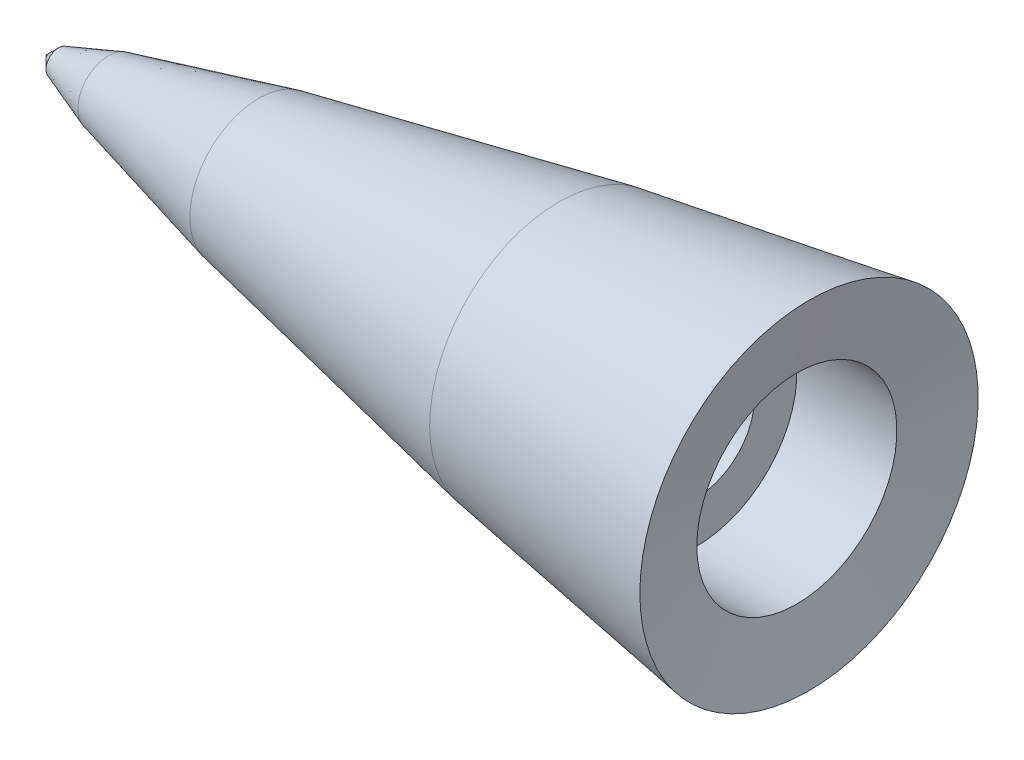
ISO-10303-21;
HEADER;
FILE_DESCRIPTION(('STEP AP214'),'2;1');
FILE_NAME('part.step','',(''),(''),'','','');
FILE_SCHEMA(('AUTOMOTIVE_DESIGN { 1 0 10303 214 1 1 1 1 }'));
ENDSEC;
DATA;
#1=APPLICATION_CONTEXT('core data for automotive mechanical design processes');
#2=APPLICATION_PROTOCOL_DEFINITION('international standard','automotive_design',2000,#1);
#3=PRODUCT_CONTEXT('',#1,'mechanical');
#4=PRODUCT('Part','Part','',(#3));
#5=PRODUCT_RELATED_PRODUCT_CATEGORY('part','',(#4));
#6=PRODUCT_DEFINITION_FORMATION('','',#4);
#7=PRODUCT_DEFINITION_CONTEXT('part definition',#1,'design');
#8=PRODUCT_DEFINITION('design','',#6,#7);
#9=PRODUCT_DEFINITION_SHAPE('','',#8);
#10=(LENGTH_UNIT() NAMED_UNIT(*) SI_UNIT(.MILLI.,.METRE.));
#11=(NAMED_UNIT(*) PLANE_ANGLE_UNIT() SI_UNIT($,.RADIAN.));
#12=(NAMED_UNIT(*) SI_UNIT($,.STERADIAN.) SOLID_ANGLE_UNIT());
#13=UNCERTAINTY_MEASURE_WITH_UNIT(LENGTH_MEASURE(1.E-05),#10,'distance_accuracy_value','');
#14=(GEOMETRIC_REPRESENTATION_CONTEXT(3) GLOBAL_UNCERTAINTY_ASSIGNED_CONTEXT((#13)) GLOBAL_UNIT_ASSIGNED_CONTEXT((#10,
#11,#12)) REPRESENTATION_CONTEXT('',''));
#15=CARTESIAN_POINT('',(0.,0.,0.));
#16=DIRECTION('',(0.,0.,1.));
#17=DIRECTION('',(1.,0.,0.));
#18=AXIS2_PLACEMENT_3D('',#15,#16,#17);
#19=CARTESIAN_POINT('',(0.,0.,0.));
#20=DIRECTION('',(-1.,0.,0.));
#21=DIRECTION('',(0.,0.,1.));
#22=AXIS2_PLACEMENT_3D('',#19,#20,#21);
#23=CYLINDRICAL_SURFACE('',#22,12.6999999999991);
#24=CARTESIAN_POINT('',(96.6194053925777,0.,0.));
#25=DIRECTION('',(-1.,0.,0.));
#26=DIRECTION('',(0.,0.,1.));
#27=AXIS2_PLACEMENT_3D('',#24,#25,#26);
#28=CIRCLE('',#27,12.6999999999991);
#29=CARTESIAN_POINT('',(96.6194053925777,0.,12.6999999999991));
#30=VERTEX_POINT('',#29);
#31=EDGE_CURVE('E44',#30,#30,#28,.T.);
#32=ORIENTED_EDGE('',*,*,#31,.F.);
#33=EDGE_LOOP('',(#32));
#34=FACE_BOUND('',#33,.T.);
#35=CARTESIAN_POINT('',(83.9194053925777,0.,0.));
#36=DIRECTION('',(-1.,0.,0.));
#37=DIRECTION('',(0.,0.,1.));
#38=AXIS2_PLACEMENT_3D('',#35,#36,#37);
#39=CIRCLE('',#38,12.6999999999991);
#40=CARTESIAN_POINT('',(83.9194053925777,0.,12.6999999999991));
#41=VERTEX_POINT('',#40);
#42=EDGE_CURVE('E11',#41,#41,#39,.T.);
#43=ORIENTED_EDGE('',*,*,#42,.T.);
#44=EDGE_LOOP('',(#43));
#45=FACE_BOUND('',#44,.T.);
#46=ADVANCED_FACE('F37',(#34,#45),#23,.F.);
#47=CARTESIAN_POINT('',(96.6194053925777,0.,0.));
#48=DIRECTION('',(1.,0.,0.));
#49=DIRECTION('',(0.,0.,-1.));
#50=AXIS2_PLACEMENT_3D('',#47,#48,#49);
#51=CONICAL_SURFACE('',#50,12.6999999999991,1.39626340127345);
#52=CARTESIAN_POINT('',(98.1654285822372,0.,0.));
#53=DIRECTION('',(-1.,0.,0.));
#54=DIRECTION('',(0.,0.,1.));
#55=AXIS2_PLACEMENT_3D('',#52,#53,#54);
#56=CIRCLE('',#55,21.4679331917127);
#57=CARTESIAN_POINT('',(98.1654285822372,0.,21.4679331917127));
#58=VERTEX_POINT('',#57);
#59=EDGE_CURVE('E76',#58,#58,#56,.T.);
#60=ORIENTED_EDGE('',*,*,#59,.F.);
#61=EDGE_LOOP('',(#60));
#62=FACE_BOUND('',#61,.T.);
#63=ORIENTED_EDGE('',*,*,#31,.T.);
#64=EDGE_LOOP('',(#63));
#65=FACE_BOUND('',#64,.T.);
#66=ADVANCED_FACE('F81',(#62,#65),#51,.F.);
#67=CARTESIAN_POINT('',(83.9194053925777,0.,-7.68858));
#68=DIRECTION('',(-1.,0.,0.));
#69=DIRECTION('',(0.,0.,1.));
#70=AXIS2_PLACEMENT_3D('',#67,#68,#69);
#71=PLANE('',#70);
#72=CARTESIAN_POINT('',(83.9194053925777,0.,0.));
#73=DIRECTION('',(1.,0.,0.));
#74=DIRECTION('',(0.,0.,-1.));
#75=AXIS2_PLACEMENT_3D('',#72,#73,#74);
#76=CIRCLE('',#75,7.34186999999999);
#77=CARTESIAN_POINT('',(83.9194053925777,0.,-7.34186999999999));
#78=VERTEX_POINT('',#77);
#79=EDGE_CURVE('E70',#78,#78,#76,.T.);
#80=ORIENTED_EDGE('',*,*,#79,.F.);
#81=EDGE_LOOP('',(#80));
#82=FACE_BOUND('',#81,.T.);
#83=ORIENTED_EDGE('',*,*,#42,.F.);
#84=EDGE_LOOP('',(#83));
#85=FACE_BOUND('',#84,.T.);
#86=ADVANCED_FACE('F87',(#82,#85),#71,.F.);
#87=CARTESIAN_POINT('',(55.9794053925777,0.,0.));
#88=DIRECTION('',(1.,0.,0.));
#89=DIRECTION('',(0.,0.,-1.));
#90=AXIS2_PLACEMENT_3D('',#87,#88,#89);
#91=CONICAL_SURFACE('',#90,7.34186999999999,1.02974425867665);
#92=CARTESIAN_POINT('',(51.5679648395578,0.,0.));
#93=VERTEX_POINT('',#92);
#94=VERTEX_LOOP('',#93);
#95=FACE_BOUND('',#94,.T.);
#96=CARTESIAN_POINT('',(55.9794053925777,0.,0.));
#97=DIRECTION('',(1.,0.,0.));
#98=DIRECTION('',(0.,0.,-1.));
#99=AXIS2_PLACEMENT_3D('',#96,#97,#98);
#100=CIRCLE('',#99,7.34186999999999);
#101=CARTESIAN_POINT('',(55.9794053925777,0.,-7.34186999999999));
#102=VERTEX_POINT('',#101);
#103=EDGE_CURVE('E73',#102,#102,#100,.T.);
#104=ORIENTED_EDGE('',*,*,#103,.T.);
#105=EDGE_LOOP('',(#104));
#106=FACE_BOUND('',#105,.T.);
#107=ADVANCED_FACE('F89',(#95,#106),#91,.F.);
#108=CARTESIAN_POINT('',(83.9194053925777,0.,0.));
#109=DIRECTION('',(1.,0.,0.));
#110=DIRECTION('',(0.,0.,-1.));
#111=AXIS2_PLACEMENT_3D('',#108,#109,#110);
#112=CYLINDRICAL_SURFACE('',#111,7.34186999999999);
#113=ORIENTED_EDGE('',*,*,#103,.F.);
#114=EDGE_LOOP('',(#113));
#115=FACE_BOUND('',#114,.T.);
#116=ORIENTED_EDGE('',*,*,#79,.T.);
#117=EDGE_LOOP('',(#116));
#118=FACE_BOUND('',#117,.T.);
#119=ADVANCED_FACE('F96',(#115,#118),#112,.F.);
#120=CARTESIAN_POINT('',(66.4154285822372,0.,0.));
#121=DIRECTION('',(1.,0.,0.));
#122=DIRECTION('',(0.,0.,-1.));
#123=AXIS2_PLACEMENT_3D('',#120,#121,#122);
#124=CONICAL_SURFACE('',#123,16.3925551731592,0.19858112453227);
#125=CARTESIAN_POINT('',(28.3154285822372,0.,0.));
#126=DIRECTION('',(-1.,0.,0.));
#127=DIRECTION('',(0.,0.,1.));
#128=AXIS2_PLACEMENT_3D('',#125,#126,#127);
#129=CIRCLE('',#128,8.72556719471178);
#130=CARTESIAN_POINT('',(28.3154285822372,0.,8.72556719471178));
#131=VERTEX_POINT('',#130);
#132=EDGE_CURVE('E62',#131,#131,#129,.T.);
#133=ORIENTED_EDGE('',*,*,#132,.F.);
#134=EDGE_LOOP('',(#133));
#135=FACE_BOUND('',#134,.T.);
#136=CARTESIAN_POINT('',(66.4154285822372,0.,0.));
#137=DIRECTION('',(-1.,0.,0.));
#138=DIRECTION('',(0.,0.,1.));
#139=AXIS2_PLACEMENT_3D('',#136,#137,#138);
#140=CIRCLE('',#139,16.3925551731592);
#141=CARTESIAN_POINT('',(66.4154285822372,0.,16.3925551731592));
#142=VERTEX_POINT('',#141);
#143=EDGE_CURVE('E67',#142,#142,#140,.T.);
#144=ORIENTED_EDGE('',*,*,#143,.T.);
#145=EDGE_LOOP('',(#144));
#146=FACE_BOUND('',#145,.T.);
#147=ADVANCED_FACE('F103',(#135,#146),#124,.T.);
#148=CARTESIAN_POINT('',(28.3154285822372,0.,0.));
#149=DIRECTION('',(1.,0.,0.));
#150=DIRECTION('',(0.,0.,-1.));
#151=AXIS2_PLACEMENT_3D('',#148,#149,#150);
#152=CONICAL_SURFACE('',#151,8.72556719471178,0.248626631446876);
#153=CARTESIAN_POINT('',(9.26542858223722,0.,0.));
#154=DIRECTION('',(-1.,0.,0.));
#155=DIRECTION('',(0.,0.,1.));
#156=AXIS2_PLACEMENT_3D('',#153,#154,#155);
#157=CIRCLE('',#156,3.88916230742835);
#158=CARTESIAN_POINT('',(9.26542858223722,0.,3.88916230742835));
#159=VERTEX_POINT('',#158);
#160=EDGE_CURVE('E59',#159,#159,#157,.T.);
#161=ORIENTED_EDGE('',*,*,#160,.F.);
#162=EDGE_LOOP('',(#161));
#163=FACE_BOUND('',#162,.T.);
#164=ORIENTED_EDGE('',*,*,#132,.T.);
#165=EDGE_LOOP('',(#164));
#166=FACE_BOUND('',#165,.T.);
#167=ADVANCED_FACE('F111',(#163,#166),#152,.T.);
#168=CARTESIAN_POINT('',(9.26542858223722,0.,0.));
#169=DIRECTION('',(1.,0.,0.));
#170=DIRECTION('',(0.,0.,-1.));
#171=AXIS2_PLACEMENT_3D('',#168,#169,#170);
#172=CONICAL_SURFACE('',#171,3.88916230742835,0.348151852603419);
#173=CARTESIAN_POINT('',(2.91542858223722,0.,0.));
#174=DIRECTION('',(-1.,0.,0.));
#175=DIRECTION('',(0.,0.,1.));
#176=AXIS2_PLACEMENT_3D('',#173,#174,#175);
#177=CIRCLE('',#176,1.58452188776878);
#178=CARTESIAN_POINT('',(2.91542858223722,0.,1.58452188776878));
#179=VERTEX_POINT('',#178);
#180=EDGE_CURVE('E57',#179,#179,#177,.T.);
#181=ORIENTED_EDGE('',*,*,#180,.F.);
#182=EDGE_LOOP('',(#181));
#183=FACE_BOUND('',#182,.T.);
#184=ORIENTED_EDGE('',*,*,#160,.T.);
#185=EDGE_LOOP('',(#184));
#186=FACE_BOUND('',#185,.T.);
#187=ADVANCED_FACE('F107',(#183,#186),#172,.T.);
#188=CARTESIAN_POINT('',(98.1654285822372,0.,0.));
#189=DIRECTION('',(1.,0.,0.));
#190=DIRECTION('',(0.,0.,-1.));
#191=AXIS2_PLACEMENT_3D('',#188,#189,#190);
#192=CONICAL_SURFACE('',#191,21.4679331917127,0.158513318422803);
#193=ORIENTED_EDGE('',*,*,#143,.F.);
#194=EDGE_LOOP('',(#193));
#195=FACE_BOUND('',#194,.T.);
#196=ORIENTED_EDGE('',*,*,#59,.T.);
#197=EDGE_LOOP('',(#196));
#198=FACE_BOUND('',#197,.T.);
#199=ADVANCED_FACE('F53',(#195,#198),#192,.T.);
#200=CARTESIAN_POINT('',(2.91542858223722,0.,0.));
#201=DIRECTION('',(1.,0.,0.));
#202=DIRECTION('',(0.,0.,-1.));
#203=AXIS2_PLACEMENT_3D('',#200,#201,#202);
#204=CONICAL_SURFACE('',#203,1.58452188776878,0.785398163397448);
#205=CARTESIAN_POINT('',(1.33090669446844,0.,0.));
#206=VERTEX_POINT('',#205);
#207=VERTEX_LOOP('',#206);
#208=FACE_BOUND('',#207,.T.);
#209=ORIENTED_EDGE('',*,*,#180,.T.);
#210=EDGE_LOOP('',(#209));
#211=FACE_BOUND('',#210,.T.);
#212=ADVANCED_FACE('F50',(#208,#211),#204,.T.);
#213=CLOSED_SHELL('',(#46,#66,#86,#107,#119,#147,#167,#187,#199,#212));
#214=MANIFOLD_SOLID_BREP('B2',#213);
#215=ADVANCED_BREP_SHAPE_REPRESENTATION('',(#18,#214),#14);
#216=SHAPE_DEFINITION_REPRESENTATION(#9,#215);
ENDSEC;
END-ISO-10303-21;
